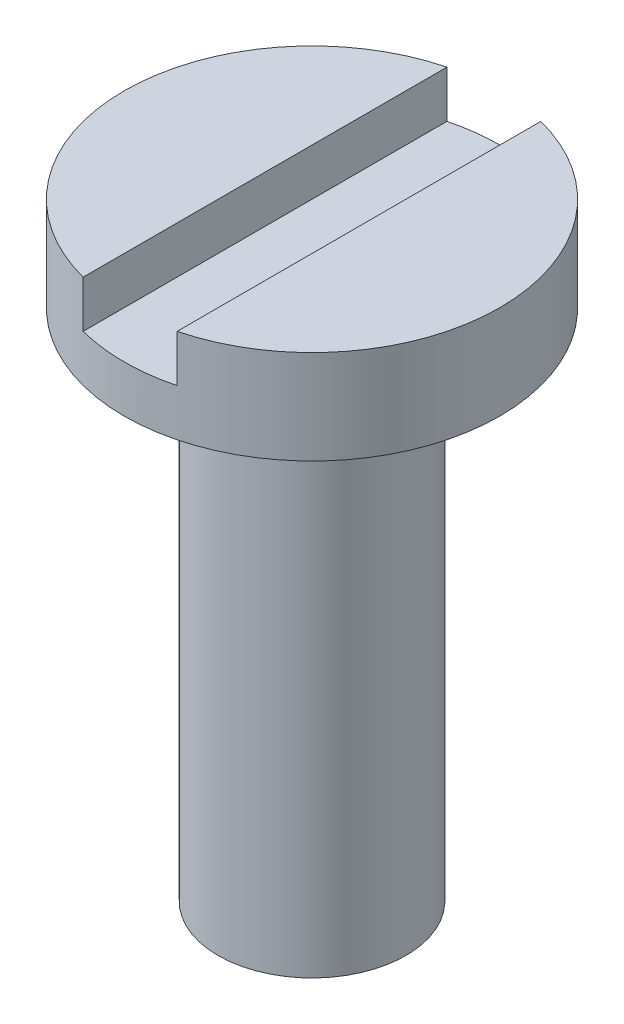
ISO-10303-21;
HEADER;
FILE_DESCRIPTION(('STEP AP214'),'2;1');
FILE_NAME('part.step','',(''),(''),'','','');
FILE_SCHEMA(('AUTOMOTIVE_DESIGN { 1 0 10303 214 1 1 1 1 }'));
ENDSEC;
DATA;
#1=APPLICATION_CONTEXT('core data for automotive mechanical design processes');
#2=APPLICATION_PROTOCOL_DEFINITION('international standard','automotive_design',2000,#1);
#3=PRODUCT_CONTEXT('',#1,'mechanical');
#4=PRODUCT('Part','Part','',(#3));
#5=PRODUCT_RELATED_PRODUCT_CATEGORY('part','',(#4));
#6=PRODUCT_DEFINITION_FORMATION('','',#4);
#7=PRODUCT_DEFINITION_CONTEXT('part definition',#1,'design');
#8=PRODUCT_DEFINITION('design','',#6,#7);
#9=PRODUCT_DEFINITION_SHAPE('','',#8);
#10=(LENGTH_UNIT() NAMED_UNIT(*) SI_UNIT(.MILLI.,.METRE.));
#11=(NAMED_UNIT(*) PLANE_ANGLE_UNIT() SI_UNIT($,.RADIAN.));
#12=(NAMED_UNIT(*) SI_UNIT($,.STERADIAN.) SOLID_ANGLE_UNIT());
#13=UNCERTAINTY_MEASURE_WITH_UNIT(LENGTH_MEASURE(1.E-05),#10,'distance_accuracy_value','');
#14=(GEOMETRIC_REPRESENTATION_CONTEXT(3) GLOBAL_UNCERTAINTY_ASSIGNED_CONTEXT((#13)) GLOBAL_UNIT_ASSIGNED_CONTEXT((#10,
#11,#12)) REPRESENTATION_CONTEXT('',''));
#15=CARTESIAN_POINT('',(0.,0.,0.));
#16=DIRECTION('',(0.,0.,1.));
#17=DIRECTION('',(1.,0.,0.));
#18=AXIS2_PLACEMENT_3D('',#15,#16,#17);
#19=CARTESIAN_POINT('',(0.,9.71132486540519,0.));
#20=DIRECTION('',(0.,1.,0.));
#21=DIRECTION('',(0.,0.,1.));
#22=AXIS2_PLACEMENT_3D('',#19,#20,#21);
#23=PLANE('',#22);
#24=DIRECTION('',(0.,0.,1.));
#25=VECTOR('',#24,1.);
#26=CARTESIAN_POINT('',(-0.75,9.71132486540519,-3.));
#27=LINE('',#26,#25);
#28=CARTESIAN_POINT('',(-0.75,9.71132486540519,-2.90473750965556));
#29=VERTEX_POINT('',#28);
#30=CARTESIAN_POINT('',(-0.75,9.71132486540519,2.90473750965556));
#31=VERTEX_POINT('',#30);
#32=EDGE_CURVE('E60',#29,#31,#27,.T.);
#33=ORIENTED_EDGE('',*,*,#32,.F.);
#34=CARTESIAN_POINT('',(0.,9.71132486540519,0.));
#35=DIRECTION('',(0.,-1.,0.));
#36=DIRECTION('',(0.,0.,-1.));
#37=AXIS2_PLACEMENT_3D('',#34,#35,#36);
#38=CIRCLE('',#37,3.);
#39=EDGE_CURVE('E107',#31,#29,#38,.T.);
#40=ORIENTED_EDGE('',*,*,#39,.F.);
#41=EDGE_LOOP('',(#33,#40));
#42=FACE_BOUND('',#41,.T.);
#43=ADVANCED_FACE('F38',(#42),#23,.T.);
#44=CARTESIAN_POINT('',(1.,-0.288675134594814,0.));
#45=DIRECTION('',(0.,-1.,0.));
#46=DIRECTION('',(0.,0.,-1.));
#47=AXIS2_PLACEMENT_3D('',#44,#45,#46);
#48=PLANE('',#47);
#49=CARTESIAN_POINT('',(0.,-0.288675134594814,0.));
#50=DIRECTION('',(0.,-1.,0.));
#51=DIRECTION('',(0.,0.,-1.));
#52=AXIS2_PLACEMENT_3D('',#49,#50,#51);
#53=CIRCLE('',#52,1.);
#54=CARTESIAN_POINT('',(0.,-0.288675134594814,-1.));
#55=VERTEX_POINT('',#54);
#56=EDGE_CURVE('E125',#55,#55,#53,.T.);
#57=ORIENTED_EDGE('',*,*,#56,.T.);
#58=EDGE_LOOP('',(#57));
#59=FACE_BOUND('',#58,.T.);
#60=ADVANCED_FACE('F40',(#59),#48,.T.);
#61=DIRECTION('',(0.,0.,1.));
#62=VECTOR('',#61,1.);
#63=CARTESIAN_POINT('',(0.75,9.71132486540519,-3.));
#64=LINE('',#63,#62);
#65=CARTESIAN_POINT('',(0.75,9.71132486540519,-2.90473750965556));
#66=VERTEX_POINT('',#65);
#67=CARTESIAN_POINT('',(0.75,9.71132486540519,2.90473750965556));
#68=VERTEX_POINT('',#67);
#69=EDGE_CURVE('E94',#66,#68,#64,.T.);
#70=ORIENTED_EDGE('',*,*,#69,.T.);
#71=EDGE_CURVE('E84',#66,#68,#38,.T.);
#72=ORIENTED_EDGE('',*,*,#71,.F.);
#73=EDGE_LOOP('',(#70,#72));
#74=FACE_BOUND('',#73,.T.);
#75=ADVANCED_FACE('F137',(#74),#23,.T.);
#76=CARTESIAN_POINT('',(0.,0.,0.));
#77=DIRECTION('',(0.,-1.,0.));
#78=DIRECTION('',(0.,0.,-1.));
#79=AXIS2_PLACEMENT_3D('',#76,#77,#78);
#80=CYLINDRICAL_SURFACE('',#79,3.);
#81=DIRECTION('',(0.,-1.,0.));
#82=VECTOR('',#81,1.);
#83=CARTESIAN_POINT('',(-0.75,0.,-2.90473750965556));
#84=LINE('',#83,#82);
#85=CARTESIAN_POINT('',(-0.75,8.96132486540519,-2.90473750965556));
#86=VERTEX_POINT('',#85);
#87=EDGE_CURVE('E11',#86,#29,#84,.F.);
#88=ORIENTED_EDGE('',*,*,#87,.F.);
#89=CARTESIAN_POINT('',(0.,8.96132486540519,0.));
#90=DIRECTION('',(0.,-1.,0.));
#91=DIRECTION('',(0.,0.,-1.));
#92=AXIS2_PLACEMENT_3D('',#89,#90,#91);
#93=CIRCLE('',#92,3.);
#94=CARTESIAN_POINT('',(0.75,8.96132486540519,-2.90473750965556));
#95=VERTEX_POINT('',#94);
#96=EDGE_CURVE('E86',#95,#86,#93,.F.);
#97=ORIENTED_EDGE('',*,*,#96,.F.);
#98=DIRECTION('',(0.,-1.,0.));
#99=VECTOR('',#98,1.);
#100=CARTESIAN_POINT('',(0.75,0.,-2.90473750965556));
#101=LINE('',#100,#99);
#102=EDGE_CURVE('E91',#66,#95,#101,.T.);
#103=ORIENTED_EDGE('',*,*,#102,.F.);
#104=ORIENTED_EDGE('',*,*,#71,.T.);
#105=DIRECTION('',(0.,-1.,0.));
#106=VECTOR('',#105,1.);
#107=CARTESIAN_POINT('',(0.75,0.,2.90473750965556));
#108=LINE('',#107,#106);
#109=CARTESIAN_POINT('',(0.75,8.96132486540519,2.90473750965556));
#110=VERTEX_POINT('',#109);
#111=EDGE_CURVE('E83',#110,#68,#108,.F.);
#112=ORIENTED_EDGE('',*,*,#111,.F.);
#113=CARTESIAN_POINT('',(-0.75,8.96132486540519,2.90473750965556));
#114=VERTEX_POINT('',#113);
#115=EDGE_CURVE('E77',#114,#110,#93,.F.);
#116=ORIENTED_EDGE('',*,*,#115,.F.);
#117=DIRECTION('',(0.,-1.,0.));
#118=VECTOR('',#117,1.);
#119=CARTESIAN_POINT('',(-0.75,0.,2.90473750965556));
#120=LINE('',#119,#118);
#121=EDGE_CURVE('E46',#31,#114,#120,.T.);
#122=ORIENTED_EDGE('',*,*,#121,.F.);
#123=ORIENTED_EDGE('',*,*,#39,.T.);
#124=EDGE_LOOP('',(#88,#97,#103,#104,#112,#116,#122,#123));
#125=FACE_BOUND('',#124,.T.);
#126=CARTESIAN_POINT('',(0.,8.21132486540519,0.));
#127=DIRECTION('',(0.,-1.,0.));
#128=DIRECTION('',(0.,0.,-1.));
#129=AXIS2_PLACEMENT_3D('',#126,#127,#128);
#130=CIRCLE('',#129,3.);
#131=CARTESIAN_POINT('',(0.,8.21132486540519,-3.));
#132=VERTEX_POINT('',#131);
#133=EDGE_CURVE('E110',#132,#132,#130,.T.);
#134=ORIENTED_EDGE('',*,*,#133,.F.);
#135=EDGE_LOOP('',(#134));
#136=FACE_BOUND('',#135,.T.);
#137=ADVANCED_FACE('F98',(#125,#136),#80,.T.);
#138=CARTESIAN_POINT('',(3.,8.21132486540519,0.));
#139=DIRECTION('',(0.,-1.,0.));
#140=DIRECTION('',(0.,0.,-1.));
#141=AXIS2_PLACEMENT_3D('',#138,#139,#140);
#142=PLANE('',#141);
#143=ORIENTED_EDGE('',*,*,#133,.T.);
#144=EDGE_LOOP('',(#143));
#145=FACE_BOUND('',#144,.T.);
#146=CARTESIAN_POINT('',(0.,8.21132486540519,0.));
#147=DIRECTION('',(0.,-1.,0.));
#148=DIRECTION('',(0.,0.,-1.));
#149=AXIS2_PLACEMENT_3D('',#146,#147,#148);
#150=CIRCLE('',#149,1.5);
#151=CARTESIAN_POINT('',(0.,8.21132486540519,-1.5));
#152=VERTEX_POINT('',#151);
#153=EDGE_CURVE('E115',#152,#152,#150,.T.);
#154=ORIENTED_EDGE('',*,*,#153,.F.);
#155=EDGE_LOOP('',(#154));
#156=FACE_BOUND('',#155,.T.);
#157=ADVANCED_FACE('F211',(#145,#156),#142,.T.);
#158=CARTESIAN_POINT('',(0.,0.,0.));
#159=DIRECTION('',(0.,-1.,0.));
#160=DIRECTION('',(0.,0.,-1.));
#161=AXIS2_PLACEMENT_3D('',#158,#159,#160);
#162=CYLINDRICAL_SURFACE('',#161,1.5);
#163=ORIENTED_EDGE('',*,*,#153,.T.);
#164=EDGE_LOOP('',(#163));
#165=FACE_BOUND('',#164,.T.);
#166=CARTESIAN_POINT('',(0.,0.,0.));
#167=DIRECTION('',(0.,-1.,0.));
#168=DIRECTION('',(0.,0.,-1.));
#169=AXIS2_PLACEMENT_3D('',#166,#167,#168);
#170=CIRCLE('',#169,1.5);
#171=CARTESIAN_POINT('',(0.,0.,-1.5));
#172=VERTEX_POINT('',#171);
#173=EDGE_CURVE('E121',#172,#172,#170,.T.);
#174=ORIENTED_EDGE('',*,*,#173,.F.);
#175=EDGE_LOOP('',(#174));
#176=FACE_BOUND('',#175,.T.);
#177=ADVANCED_FACE('F155',(#165,#176),#162,.T.);
#178=CARTESIAN_POINT('',(0.,-0.288675134594814,0.));
#179=DIRECTION('',(0.,1.,0.));
#180=DIRECTION('',(0.,0.,1.));
#181=AXIS2_PLACEMENT_3D('',#178,#179,#180);
#182=CONICAL_SURFACE('',#181,1.,1.0471975511966);
#183=ORIENTED_EDGE('',*,*,#173,.T.);
#184=EDGE_LOOP('',(#183));
#185=FACE_BOUND('',#184,.T.);
#186=ORIENTED_EDGE('',*,*,#56,.F.);
#187=EDGE_LOOP('',(#186));
#188=FACE_BOUND('',#187,.T.);
#189=ADVANCED_FACE('F151',(#185,#188),#182,.T.);
#190=CARTESIAN_POINT('',(-0.75,9.71132486540519,-3.));
#191=DIRECTION('',(-1.,0.,0.));
#192=DIRECTION('',(0.,0.,1.));
#193=AXIS2_PLACEMENT_3D('',#190,#191,#192);
#194=PLANE('',#193);
#195=ORIENTED_EDGE('',*,*,#87,.T.);
#196=ORIENTED_EDGE('',*,*,#32,.T.);
#197=ORIENTED_EDGE('',*,*,#121,.T.);
#198=DIRECTION('',(0.,0.,1.));
#199=VECTOR('',#198,1.);
#200=CARTESIAN_POINT('',(-0.75,8.96132486540519,-3.));
#201=LINE('',#200,#199);
#202=EDGE_CURVE('E80',#86,#114,#201,.T.);
#203=ORIENTED_EDGE('',*,*,#202,.F.);
#204=EDGE_LOOP('',(#195,#196,#197,#203));
#205=FACE_BOUND('',#204,.T.);
#206=ADVANCED_FACE('F104',(#205),#194,.F.);
#207=CARTESIAN_POINT('',(0.75,9.71132486540519,-3.));
#208=DIRECTION('',(1.,0.,0.));
#209=DIRECTION('',(0.,0.,-1.));
#210=AXIS2_PLACEMENT_3D('',#207,#208,#209);
#211=PLANE('',#210);
#212=ORIENTED_EDGE('',*,*,#111,.T.);
#213=ORIENTED_EDGE('',*,*,#69,.F.);
#214=ORIENTED_EDGE('',*,*,#102,.T.);
#215=DIRECTION('',(0.,0.,1.));
#216=VECTOR('',#215,1.);
#217=CARTESIAN_POINT('',(0.75,8.96132486540519,-3.));
#218=LINE('',#217,#216);
#219=EDGE_CURVE('E53',#95,#110,#218,.T.);
#220=ORIENTED_EDGE('',*,*,#219,.T.);
#221=EDGE_LOOP('',(#212,#213,#214,#220));
#222=FACE_BOUND('',#221,.T.);
#223=ADVANCED_FACE('F88',(#222),#211,.F.);
#224=CARTESIAN_POINT('',(-0.75,8.96132486540519,-3.));
#225=DIRECTION('',(0.,-1.,0.));
#226=DIRECTION('',(0.,0.,-1.));
#227=AXIS2_PLACEMENT_3D('',#224,#225,#226);
#228=PLANE('',#227);
#229=ORIENTED_EDGE('',*,*,#202,.T.);
#230=ORIENTED_EDGE('',*,*,#115,.T.);
#231=ORIENTED_EDGE('',*,*,#219,.F.);
#232=ORIENTED_EDGE('',*,*,#96,.T.);
#233=EDGE_LOOP('',(#229,#230,#231,#232));
#234=FACE_BOUND('',#233,.T.);
#235=ADVANCED_FACE('F78',(#234),#228,.F.);
#236=CLOSED_SHELL('',(#43,#60,#75,#137,#157,#177,#189,#206,#223,#235));
#237=MANIFOLD_SOLID_BREP('B2',#236);
#238=ADVANCED_BREP_SHAPE_REPRESENTATION('',(#18,#237),#14);
#239=SHAPE_DEFINITION_REPRESENTATION(#9,#238);
ENDSEC;
END-ISO-10303-21;
